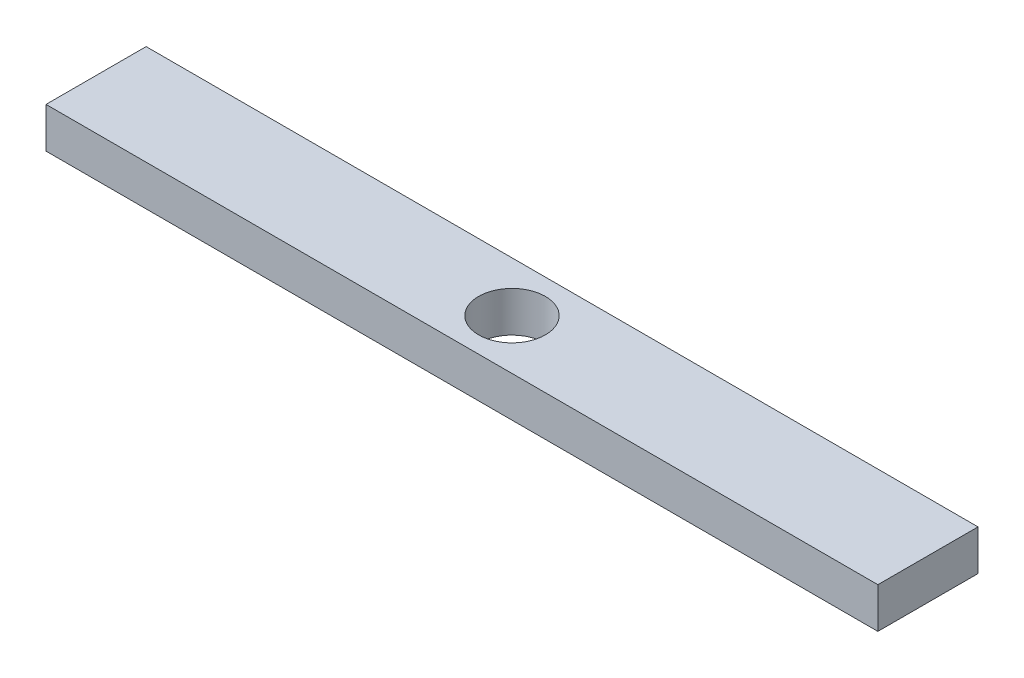
ISO-10303-21;
HEADER;
FILE_DESCRIPTION(('STEP AP214'),'2;1');
FILE_NAME('part.step','',(''),(''),'','','');
FILE_SCHEMA(('AUTOMOTIVE_DESIGN { 1 0 10303 214 1 1 1 1 }'));
ENDSEC;
DATA;
#1=APPLICATION_CONTEXT('core data for automotive mechanical design processes');
#2=APPLICATION_PROTOCOL_DEFINITION('international standard','automotive_design',2000,#1);
#3=PRODUCT_CONTEXT('',#1,'mechanical');
#4=PRODUCT('Part','Part','',(#3));
#5=PRODUCT_RELATED_PRODUCT_CATEGORY('part','',(#4));
#6=PRODUCT_DEFINITION_FORMATION('','',#4);
#7=PRODUCT_DEFINITION_CONTEXT('part definition',#1,'design');
#8=PRODUCT_DEFINITION('design','',#6,#7);
#9=PRODUCT_DEFINITION_SHAPE('','',#8);
#10=(LENGTH_UNIT() NAMED_UNIT(*) SI_UNIT(.MILLI.,.METRE.));
#11=(NAMED_UNIT(*) PLANE_ANGLE_UNIT() SI_UNIT($,.RADIAN.));
#12=(NAMED_UNIT(*) SI_UNIT($,.STERADIAN.) SOLID_ANGLE_UNIT());
#13=UNCERTAINTY_MEASURE_WITH_UNIT(LENGTH_MEASURE(1.E-05),#10,'distance_accuracy_value','');
#14=(GEOMETRIC_REPRESENTATION_CONTEXT(3) GLOBAL_UNCERTAINTY_ASSIGNED_CONTEXT((#13)) GLOBAL_UNIT_ASSIGNED_CONTEXT((#10,
#11,#12)) REPRESENTATION_CONTEXT('',''));
#15=CARTESIAN_POINT('',(0.,0.,0.));
#16=DIRECTION('',(0.,0.,1.));
#17=DIRECTION('',(1.,0.,0.));
#18=AXIS2_PLACEMENT_3D('',#15,#16,#17);
#19=CARTESIAN_POINT('',(2.54,2.79,13.125));
#20=DIRECTION('',(0.,-1.,0.));
#21=DIRECTION('',(1.,0.,0.));
#22=AXIS2_PLACEMENT_3D('',#19,#20,#21);
#23=CYLINDRICAL_SURFACE('',#22,0.4);
#24=CARTESIAN_POINT('',(2.54,2.79,13.125));
#25=DIRECTION('',(0.,-1.,0.));
#26=DIRECTION('',(1.,0.,0.));
#27=AXIS2_PLACEMENT_3D('',#24,#25,#26);
#28=CIRCLE('',#27,0.4);
#29=CARTESIAN_POINT('',(2.94,2.79,13.125));
#30=VERTEX_POINT('',#29);
#31=EDGE_CURVE('E128',#30,#30,#28,.T.);
#32=ORIENTED_EDGE('',*,*,#31,.F.);
#33=DIRECTION('',(0.,-1.,0.));
#34=VECTOR('',#33,1.);
#35=CARTESIAN_POINT('',(2.94,2.79,13.125));
#36=LINE('',#35,#34);
#37=CARTESIAN_POINT('',(2.94,2.305,13.125));
#38=VERTEX_POINT('',#37);
#39=EDGE_CURVE('E11',#30,#38,#36,.T.);
#40=ORIENTED_EDGE('',*,*,#39,.T.);
#41=CARTESIAN_POINT('',(2.54,2.305,13.125));
#42=DIRECTION('',(0.,-1.,0.));
#43=DIRECTION('',(1.,0.,0.));
#44=AXIS2_PLACEMENT_3D('',#41,#42,#43);
#45=CIRCLE('',#44,0.4);
#46=EDGE_CURVE('E86',#38,#38,#45,.T.);
#47=ORIENTED_EDGE('',*,*,#46,.T.);
#48=ORIENTED_EDGE('',*,*,#39,.F.);
#49=EDGE_LOOP('',(#32,#40,#47,#48));
#50=FACE_BOUND('',#49,.T.);
#51=ADVANCED_FACE('F16',(#50),#23,.F.);
#52=CARTESIAN_POINT('',(7.525,2.305,12.525));
#53=DIRECTION('',(1.,0.,0.));
#54=DIRECTION('',(0.,1.,0.));
#55=AXIS2_PLACEMENT_3D('',#52,#53,#54);
#56=PLANE('',#55);
#57=DIRECTION('',(0.,0.,1.));
#58=VECTOR('',#57,1.);
#59=CARTESIAN_POINT('',(7.525,2.305,12.525));
#60=LINE('',#59,#58);
#61=CARTESIAN_POINT('',(7.525,2.305,12.525));
#62=VERTEX_POINT('',#61);
#63=CARTESIAN_POINT('',(7.525,2.305,13.725));
#64=VERTEX_POINT('',#63);
#65=EDGE_CURVE('E79',#62,#64,#60,.T.);
#66=ORIENTED_EDGE('',*,*,#65,.F.);
#67=DIRECTION('',(0.,1.,0.));
#68=VECTOR('',#67,1.);
#69=CARTESIAN_POINT('',(7.525,2.305,12.525));
#70=LINE('',#69,#68);
#71=CARTESIAN_POINT('',(7.525,2.79,12.525));
#72=VERTEX_POINT('',#71);
#73=EDGE_CURVE('E27',#62,#72,#70,.T.);
#74=ORIENTED_EDGE('',*,*,#73,.T.);
#75=DIRECTION('',(0.,0.,1.));
#76=VECTOR('',#75,1.);
#77=CARTESIAN_POINT('',(7.525,2.79,12.525));
#78=LINE('',#77,#76);
#79=CARTESIAN_POINT('',(7.525,2.79,13.725));
#80=VERTEX_POINT('',#79);
#81=EDGE_CURVE('E81',#72,#80,#78,.T.);
#82=ORIENTED_EDGE('',*,*,#81,.T.);
#83=DIRECTION('',(0.,1.,0.));
#84=VECTOR('',#83,1.);
#85=CARTESIAN_POINT('',(7.525,2.305,13.725));
#86=LINE('',#85,#84);
#87=EDGE_CURVE('E75',#64,#80,#86,.T.);
#88=ORIENTED_EDGE('',*,*,#87,.F.);
#89=EDGE_LOOP('',(#66,#74,#82,#88));
#90=FACE_BOUND('',#89,.T.);
#91=ADVANCED_FACE('F77',(#90),#56,.T.);
#92=CARTESIAN_POINT('',(-2.445,2.305,12.525));
#93=DIRECTION('',(0.,0.,1.));
#94=DIRECTION('',(1.,0.,0.));
#95=AXIS2_PLACEMENT_3D('',#92,#93,#94);
#96=PLANE('',#95);
#97=DIRECTION('',(1.,0.,0.));
#98=VECTOR('',#97,1.);
#99=CARTESIAN_POINT('',(-2.445,2.79,12.525));
#100=LINE('',#99,#98);
#101=CARTESIAN_POINT('',(-2.445,2.79,12.525));
#102=VERTEX_POINT('',#101);
#103=EDGE_CURVE('E112',#102,#72,#100,.T.);
#104=ORIENTED_EDGE('',*,*,#103,.T.);
#105=ORIENTED_EDGE('',*,*,#73,.F.);
#106=DIRECTION('',(1.,0.,0.));
#107=VECTOR('',#106,1.);
#108=CARTESIAN_POINT('',(-2.445,2.305,12.525));
#109=LINE('',#108,#107);
#110=CARTESIAN_POINT('',(-2.445,2.305,12.525));
#111=VERTEX_POINT('',#110);
#112=EDGE_CURVE('E96',#111,#62,#109,.T.);
#113=ORIENTED_EDGE('',*,*,#112,.F.);
#114=DIRECTION('',(0.,1.,0.));
#115=VECTOR('',#114,1.);
#116=CARTESIAN_POINT('',(-2.445,2.305,12.525));
#117=LINE('',#116,#115);
#118=EDGE_CURVE('E106',#111,#102,#117,.T.);
#119=ORIENTED_EDGE('',*,*,#118,.T.);
#120=EDGE_LOOP('',(#104,#105,#113,#119));
#121=FACE_BOUND('',#120,.T.);
#122=ADVANCED_FACE('F148',(#121),#96,.F.);
#123=CARTESIAN_POINT('',(-2.445,2.79,12.525));
#124=DIRECTION('',(0.,1.,0.));
#125=DIRECTION('',(1.,0.,0.));
#126=AXIS2_PLACEMENT_3D('',#123,#124,#125);
#127=PLANE('',#126);
#128=ORIENTED_EDGE('',*,*,#31,.T.);
#129=EDGE_LOOP('',(#128));
#130=FACE_BOUND('',#129,.T.);
#131=ORIENTED_EDGE('',*,*,#103,.F.);
#132=DIRECTION('',(0.,0.,1.));
#133=VECTOR('',#132,1.);
#134=CARTESIAN_POINT('',(-2.445,2.79,12.525));
#135=LINE('',#134,#133);
#136=CARTESIAN_POINT('',(-2.445,2.79,13.725));
#137=VERTEX_POINT('',#136);
#138=EDGE_CURVE('E114',#102,#137,#135,.T.);
#139=ORIENTED_EDGE('',*,*,#138,.T.);
#140=DIRECTION('',(1.,0.,0.));
#141=VECTOR('',#140,1.);
#142=CARTESIAN_POINT('',(-2.445,2.79,13.725));
#143=LINE('',#142,#141);
#144=EDGE_CURVE('E85',#137,#80,#143,.T.);
#145=ORIENTED_EDGE('',*,*,#144,.T.);
#146=ORIENTED_EDGE('',*,*,#81,.F.);
#147=EDGE_LOOP('',(#131,#139,#145,#146));
#148=FACE_BOUND('',#147,.T.);
#149=ADVANCED_FACE('F150',(#130,#148),#127,.T.);
#150=CARTESIAN_POINT('',(-2.445,2.305,13.725));
#151=DIRECTION('',(0.,0.,1.));
#152=DIRECTION('',(1.,0.,0.));
#153=AXIS2_PLACEMENT_3D('',#150,#151,#152);
#154=PLANE('',#153);
#155=DIRECTION('',(0.,1.,0.));
#156=VECTOR('',#155,1.);
#157=CARTESIAN_POINT('',(-2.445,2.305,13.725));
#158=LINE('',#157,#156);
#159=CARTESIAN_POINT('',(-2.445,2.305,13.725));
#160=VERTEX_POINT('',#159);
#161=EDGE_CURVE('E91',#160,#137,#158,.T.);
#162=ORIENTED_EDGE('',*,*,#161,.F.);
#163=DIRECTION('',(1.,0.,0.));
#164=VECTOR('',#163,1.);
#165=CARTESIAN_POINT('',(-2.445,2.305,13.725));
#166=LINE('',#165,#164);
#167=EDGE_CURVE('E20',#160,#64,#166,.T.);
#168=ORIENTED_EDGE('',*,*,#167,.T.);
#169=ORIENTED_EDGE('',*,*,#87,.T.);
#170=ORIENTED_EDGE('',*,*,#144,.F.);
#171=EDGE_LOOP('',(#162,#168,#169,#170));
#172=FACE_BOUND('',#171,.T.);
#173=ADVANCED_FACE('F89',(#172),#154,.T.);
#174=CARTESIAN_POINT('',(-2.445,2.305,12.525));
#175=DIRECTION('',(0.,1.,0.));
#176=DIRECTION('',(1.,0.,0.));
#177=AXIS2_PLACEMENT_3D('',#174,#175,#176);
#178=PLANE('',#177);
#179=ORIENTED_EDGE('',*,*,#46,.F.);
#180=EDGE_LOOP('',(#179));
#181=FACE_BOUND('',#180,.T.);
#182=ORIENTED_EDGE('',*,*,#65,.T.);
#183=ORIENTED_EDGE('',*,*,#167,.F.);
#184=DIRECTION('',(0.,0.,1.));
#185=VECTOR('',#184,1.);
#186=CARTESIAN_POINT('',(-2.445,2.305,12.525));
#187=LINE('',#186,#185);
#188=EDGE_CURVE('E100',#111,#160,#187,.T.);
#189=ORIENTED_EDGE('',*,*,#188,.F.);
#190=ORIENTED_EDGE('',*,*,#112,.T.);
#191=EDGE_LOOP('',(#182,#183,#189,#190));
#192=FACE_BOUND('',#191,.T.);
#193=ADVANCED_FACE('F18',(#181,#192),#178,.F.);
#194=CARTESIAN_POINT('',(-2.445,2.305,12.525));
#195=DIRECTION('',(1.,0.,0.));
#196=DIRECTION('',(0.,1.,0.));
#197=AXIS2_PLACEMENT_3D('',#194,#195,#196);
#198=PLANE('',#197);
#199=ORIENTED_EDGE('',*,*,#161,.T.);
#200=ORIENTED_EDGE('',*,*,#138,.F.);
#201=ORIENTED_EDGE('',*,*,#118,.F.);
#202=ORIENTED_EDGE('',*,*,#188,.T.);
#203=EDGE_LOOP('',(#199,#200,#201,#202));
#204=FACE_BOUND('',#203,.T.);
#205=ADVANCED_FACE('F167',(#204),#198,.F.);
#206=CLOSED_SHELL('',(#51,#91,#122,#149,#173,#193,#205));
#207=MANIFOLD_SOLID_BREP('B1',#206);
#208=ADVANCED_BREP_SHAPE_REPRESENTATION('',(#18,#207),#14);
#209=SHAPE_DEFINITION_REPRESENTATION(#9,#208);
ENDSEC;
END-ISO-10303-21;
